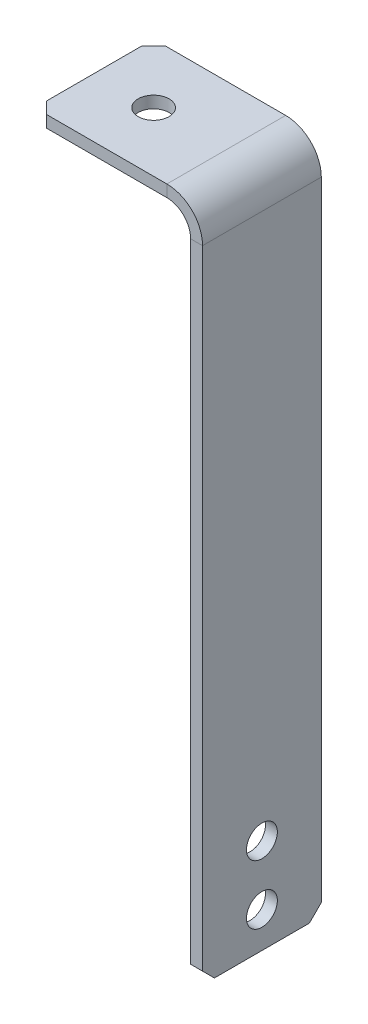
ISO-10303-21;
HEADER;
FILE_DESCRIPTION(('STEP AP214'),'2;1');
FILE_NAME('part.step','',(''),(''),'','','');
FILE_SCHEMA(('AUTOMOTIVE_DESIGN { 1 0 10303 214 1 1 1 1 }'));
ENDSEC;
DATA;
#1=APPLICATION_CONTEXT('core data for automotive mechanical design processes');
#2=APPLICATION_PROTOCOL_DEFINITION('international standard','automotive_design',2000,#1);
#3=PRODUCT_CONTEXT('',#1,'mechanical');
#4=PRODUCT('Part','Part','',(#3));
#5=PRODUCT_RELATED_PRODUCT_CATEGORY('part','',(#4));
#6=PRODUCT_DEFINITION_FORMATION('','',#4);
#7=PRODUCT_DEFINITION_CONTEXT('part definition',#1,'design');
#8=PRODUCT_DEFINITION('design','',#6,#7);
#9=PRODUCT_DEFINITION_SHAPE('','',#8);
#10=(LENGTH_UNIT() NAMED_UNIT(*) SI_UNIT(.MILLI.,.METRE.));
#11=(NAMED_UNIT(*) PLANE_ANGLE_UNIT() SI_UNIT($,.RADIAN.));
#12=(NAMED_UNIT(*) SI_UNIT($,.STERADIAN.) SOLID_ANGLE_UNIT());
#13=UNCERTAINTY_MEASURE_WITH_UNIT(LENGTH_MEASURE(1.E-05),#10,'distance_accuracy_value','');
#14=(GEOMETRIC_REPRESENTATION_CONTEXT(3) GLOBAL_UNCERTAINTY_ASSIGNED_CONTEXT((#13)) GLOBAL_UNIT_ASSIGNED_CONTEXT((#10,
#11,#12)) REPRESENTATION_CONTEXT('',''));
#15=CARTESIAN_POINT('',(0.,0.,0.));
#16=DIRECTION('',(0.,0.,1.));
#17=DIRECTION('',(1.,0.,0.));
#18=AXIS2_PLACEMENT_3D('',#15,#16,#17);
#19=CARTESIAN_POINT('',(0.,269.5,50.));
#20=DIRECTION('',(0.,0.,1.));
#21=DIRECTION('',(1.,0.,0.));
#22=AXIS2_PLACEMENT_3D('',#19,#20,#21);
#23=PLANE('',#22);
#24=DIRECTION('',(-1.,0.,0.));
#25=VECTOR('',#24,1.);
#26=CARTESIAN_POINT('',(0.,269.5,50.));
#27=LINE('',#26,#25);
#28=CARTESIAN_POINT('',(0.,269.5,50.));
#29=VERTEX_POINT('',#28);
#30=CARTESIAN_POINT('',(-4.99999999999999,269.5,50.));
#31=VERTEX_POINT('',#30);
#32=EDGE_CURVE('E134',#29,#31,#27,.T.);
#33=ORIENTED_EDGE('',*,*,#32,.F.);
#34=CARTESIAN_POINT('',(-15.,269.5,50.));
#35=DIRECTION('',(0.,0.,1.));
#36=DIRECTION('',(1.,0.,0.));
#37=AXIS2_PLACEMENT_3D('',#34,#35,#36);
#38=CIRCLE('',#37,15.);
#39=CARTESIAN_POINT('',(-15.,284.5,50.));
#40=VERTEX_POINT('',#39);
#41=EDGE_CURVE('E138',#40,#29,#38,.F.);
#42=ORIENTED_EDGE('',*,*,#41,.F.);
#43=DIRECTION('',(0.,1.,0.));
#44=VECTOR('',#43,1.);
#45=CARTESIAN_POINT('',(-15.,279.5,50.));
#46=LINE('',#45,#44);
#47=CARTESIAN_POINT('',(-15.,279.5,50.));
#48=VERTEX_POINT('',#47);
#49=EDGE_CURVE('E143',#48,#40,#46,.T.);
#50=ORIENTED_EDGE('',*,*,#49,.F.);
#51=CARTESIAN_POINT('',(-15.,269.5,50.));
#52=DIRECTION('',(0.,0.,1.));
#53=DIRECTION('',(1.,0.,0.));
#54=AXIS2_PLACEMENT_3D('',#51,#52,#53);
#55=CIRCLE('',#54,10.);
#56=EDGE_CURVE('E140',#48,#31,#55,.F.);
#57=ORIENTED_EDGE('',*,*,#56,.T.);
#58=EDGE_LOOP('',(#33,#42,#50,#57));
#59=FACE_BOUND('',#58,.T.);
#60=ADVANCED_FACE('F45',(#59),#23,.T.);
#61=CARTESIAN_POINT('',(-15.,279.5,50.));
#62=DIRECTION('',(0.,0.,1.));
#63=DIRECTION('',(1.,0.,0.));
#64=AXIS2_PLACEMENT_3D('',#61,#62,#63);
#65=PLANE('',#64);
#66=DIRECTION('',(0.,-1.,0.));
#67=VECTOR('',#66,1.);
#68=CARTESIAN_POINT('',(-4.99999999999998,284.5,50.));
#69=LINE('',#68,#67);
#70=CARTESIAN_POINT('',(-5.,5.00000000000006,50.));
#71=VERTEX_POINT('',#70);
#72=EDGE_CURVE('E161',#31,#71,#69,.T.);
#73=ORIENTED_EDGE('',*,*,#72,.T.);
#74=DIRECTION('',(1.,0.,0.));
#75=VECTOR('',#74,1.);
#76=CARTESIAN_POINT('',(-15.,5.00000000000006,50.));
#77=LINE('',#76,#75);
#78=CARTESIAN_POINT('',(0.,5.00000000000006,50.));
#79=VERTEX_POINT('',#78);
#80=EDGE_CURVE('E53',#71,#79,#77,.T.);
#81=ORIENTED_EDGE('',*,*,#80,.T.);
#82=DIRECTION('',(0.,-1.,0.));
#83=VECTOR('',#82,1.);
#84=CARTESIAN_POINT('',(0.,284.5,50.));
#85=LINE('',#84,#83);
#86=EDGE_CURVE('E150',#29,#79,#85,.T.);
#87=ORIENTED_EDGE('',*,*,#86,.F.);
#88=ORIENTED_EDGE('',*,*,#32,.T.);
#89=EDGE_LOOP('',(#73,#81,#87,#88));
#90=FACE_BOUND('',#89,.T.);
#91=ADVANCED_FACE('F160',(#90),#65,.T.);
#92=CARTESIAN_POINT('',(-15.,284.5,0.));
#93=DIRECTION('',(0.,0.,-1.));
#94=DIRECTION('',(-1.,0.,0.));
#95=AXIS2_PLACEMENT_3D('',#92,#93,#94);
#96=PLANE('',#95);
#97=DIRECTION('',(0.,-1.,0.));
#98=VECTOR('',#97,1.);
#99=CARTESIAN_POINT('',(-15.,284.5,0.));
#100=LINE('',#99,#98);
#101=CARTESIAN_POINT('',(-15.,284.5,0.));
#102=VERTEX_POINT('',#101);
#103=CARTESIAN_POINT('',(-15.,279.5,0.));
#104=VERTEX_POINT('',#103);
#105=EDGE_CURVE('E204',#102,#104,#100,.T.);
#106=ORIENTED_EDGE('',*,*,#105,.F.);
#107=CARTESIAN_POINT('',(-15.,269.5,0.));
#108=DIRECTION('',(0.,0.,1.));
#109=DIRECTION('',(1.,0.,0.));
#110=AXIS2_PLACEMENT_3D('',#107,#108,#109);
#111=CIRCLE('',#110,15.);
#112=CARTESIAN_POINT('',(0.,269.5,0.));
#113=VERTEX_POINT('',#112);
#114=EDGE_CURVE('E180',#102,#113,#111,.F.);
#115=ORIENTED_EDGE('',*,*,#114,.T.);
#116=DIRECTION('',(1.,0.,0.));
#117=VECTOR('',#116,1.);
#118=CARTESIAN_POINT('',(-4.99999999999999,269.5,0.));
#119=LINE('',#118,#117);
#120=CARTESIAN_POINT('',(-4.99999999999999,269.5,0.));
#121=VERTEX_POINT('',#120);
#122=EDGE_CURVE('E202',#121,#113,#119,.T.);
#123=ORIENTED_EDGE('',*,*,#122,.F.);
#124=CARTESIAN_POINT('',(-15.,269.5,0.));
#125=DIRECTION('',(0.,0.,1.));
#126=DIRECTION('',(1.,0.,0.));
#127=AXIS2_PLACEMENT_3D('',#124,#125,#126);
#128=CIRCLE('',#127,10.);
#129=EDGE_CURVE('E186',#104,#121,#128,.F.);
#130=ORIENTED_EDGE('',*,*,#129,.F.);
#131=EDGE_LOOP('',(#106,#115,#123,#130));
#132=FACE_BOUND('',#131,.T.);
#133=ADVANCED_FACE('F269',(#132),#96,.T.);
#134=CARTESIAN_POINT('',(-4.99999999999999,269.5,0.));
#135=DIRECTION('',(0.,0.,-1.));
#136=DIRECTION('',(-1.,0.,0.));
#137=AXIS2_PLACEMENT_3D('',#134,#135,#136);
#138=PLANE('',#137);
#139=DIRECTION('',(1.,0.,0.));
#140=VECTOR('',#139,1.);
#141=CARTESIAN_POINT('',(-70.6,279.5,0.));
#142=LINE('',#141,#140);
#143=CARTESIAN_POINT('',(-65.6,279.5,0.));
#144=VERTEX_POINT('',#143);
#145=EDGE_CURVE('E184',#144,#104,#142,.T.);
#146=ORIENTED_EDGE('',*,*,#145,.F.);
#147=DIRECTION('',(0.,1.,0.));
#148=VECTOR('',#147,1.);
#149=CARTESIAN_POINT('',(-65.6,269.5,0.));
#150=LINE('',#149,#148);
#151=CARTESIAN_POINT('',(-65.6,284.5,0.));
#152=VERTEX_POINT('',#151);
#153=EDGE_CURVE('E142',#144,#152,#150,.T.);
#154=ORIENTED_EDGE('',*,*,#153,.T.);
#155=DIRECTION('',(1.,0.,0.));
#156=VECTOR('',#155,1.);
#157=CARTESIAN_POINT('',(-70.6,284.5,0.));
#158=LINE('',#157,#156);
#159=EDGE_CURVE('E182',#152,#102,#158,.T.);
#160=ORIENTED_EDGE('',*,*,#159,.T.);
#161=ORIENTED_EDGE('',*,*,#105,.T.);
#162=EDGE_LOOP('',(#146,#154,#160,#161));
#163=FACE_BOUND('',#162,.T.);
#164=ADVANCED_FACE('F286',(#163),#138,.T.);
#165=CARTESIAN_POINT('',(-4.99999999999998,284.5,50.));
#166=DIRECTION('',(1.,0.,0.));
#167=DIRECTION('',(0.,1.,0.));
#168=AXIS2_PLACEMENT_3D('',#165,#166,#167);
#169=PLANE('',#168);
#170=CARTESIAN_POINT('',(-5.00000000000001,40.,25.));
#171=DIRECTION('',(-1.,0.,0.));
#172=DIRECTION('',(0.,-1.,0.));
#173=AXIS2_PLACEMENT_3D('',#170,#171,#172);
#174=CIRCLE('',#173,6.5);
#175=CARTESIAN_POINT('',(-5.00000000000001,33.5,25.));
#176=VERTEX_POINT('',#175);
#177=EDGE_CURVE('E216',#176,#176,#174,.T.);
#178=ORIENTED_EDGE('',*,*,#177,.F.);
#179=EDGE_LOOP('',(#178));
#180=FACE_BOUND('',#179,.T.);
#181=CARTESIAN_POINT('',(-5.,15.,25.));
#182=DIRECTION('',(-1.,0.,0.));
#183=DIRECTION('',(0.,-1.,0.));
#184=AXIS2_PLACEMENT_3D('',#181,#182,#183);
#185=CIRCLE('',#184,6.5);
#186=CARTESIAN_POINT('',(-5.,8.50000000000001,25.));
#187=VERTEX_POINT('',#186);
#188=EDGE_CURVE('E276',#187,#187,#185,.T.);
#189=ORIENTED_EDGE('',*,*,#188,.F.);
#190=EDGE_LOOP('',(#189));
#191=FACE_BOUND('',#190,.T.);
#192=DIRECTION('',(0.,0.,-1.));
#193=VECTOR('',#192,1.);
#194=CARTESIAN_POINT('',(-5.,0.,50.));
#195=LINE('',#194,#193);
#196=CARTESIAN_POINT('',(-5.,0.,45.));
#197=VERTEX_POINT('',#196);
#198=CARTESIAN_POINT('',(-5.,0.,5.00000000000003));
#199=VERTEX_POINT('',#198);
#200=EDGE_CURVE('E200',#197,#199,#195,.T.);
#201=ORIENTED_EDGE('',*,*,#200,.F.);
#202=DIRECTION('',(0.,-0.707106781186549,-0.707106781186546));
#203=VECTOR('',#202,1.);
#204=CARTESIAN_POINT('',(-5.,0.,45.));
#205=LINE('',#204,#203);
#206=EDGE_CURVE('E67',#197,#71,#205,.F.);
#207=ORIENTED_EDGE('',*,*,#206,.T.);
#208=ORIENTED_EDGE('',*,*,#72,.F.);
#209=DIRECTION('',(0.,0.,-1.));
#210=VECTOR('',#209,1.);
#211=CARTESIAN_POINT('',(-4.99999999999999,269.5,50.));
#212=LINE('',#211,#210);
#213=EDGE_CURVE('E174',#31,#121,#212,.T.);
#214=ORIENTED_EDGE('',*,*,#213,.T.);
#215=DIRECTION('',(0.,-1.,0.));
#216=VECTOR('',#215,1.);
#217=CARTESIAN_POINT('',(-4.99999999999998,284.5,0.));
#218=LINE('',#217,#216);
#219=CARTESIAN_POINT('',(-5.,5.00000000000006,0.));
#220=VERTEX_POINT('',#219);
#221=EDGE_CURVE('E175',#121,#220,#218,.T.);
#222=ORIENTED_EDGE('',*,*,#221,.T.);
#223=DIRECTION('',(0.,-0.707106781186549,0.707106781186546));
#224=VECTOR('',#223,1.);
#225=CARTESIAN_POINT('',(-5.,5.00000000000006,0.));
#226=LINE('',#225,#224);
#227=EDGE_CURVE('E241',#220,#199,#226,.T.);
#228=ORIENTED_EDGE('',*,*,#227,.T.);
#229=EDGE_LOOP('',(#201,#207,#208,#214,#222,#228));
#230=FACE_BOUND('',#229,.T.);
#231=ADVANCED_FACE('F257',(#180,#191,#230),#169,.F.);
#232=CARTESIAN_POINT('',(0.,0.,50.));
#233=DIRECTION('',(0.,-1.,0.));
#234=DIRECTION('',(0.,0.,-1.));
#235=AXIS2_PLACEMENT_3D('',#232,#233,#234);
#236=PLANE('',#235);
#237=DIRECTION('',(0.,0.,-1.));
#238=VECTOR('',#237,1.);
#239=CARTESIAN_POINT('',(0.,0.,50.));
#240=LINE('',#239,#238);
#241=CARTESIAN_POINT('',(0.,0.,45.));
#242=VERTEX_POINT('',#241);
#243=CARTESIAN_POINT('',(0.,0.,5.00000000000003));
#244=VERTEX_POINT('',#243);
#245=EDGE_CURVE('E157',#242,#244,#240,.T.);
#246=ORIENTED_EDGE('',*,*,#245,.F.);
#247=DIRECTION('',(-1.,0.,0.));
#248=VECTOR('',#247,1.);
#249=CARTESIAN_POINT('',(0.,0.,45.));
#250=LINE('',#249,#248);
#251=EDGE_CURVE('E249',#242,#197,#250,.T.);
#252=ORIENTED_EDGE('',*,*,#251,.T.);
#253=ORIENTED_EDGE('',*,*,#200,.T.);
#254=DIRECTION('',(1.,0.,0.));
#255=VECTOR('',#254,1.);
#256=CARTESIAN_POINT('',(0.,0.,5.00000000000003));
#257=LINE('',#256,#255);
#258=EDGE_CURVE('E244',#199,#244,#257,.T.);
#259=ORIENTED_EDGE('',*,*,#258,.T.);
#260=EDGE_LOOP('',(#246,#252,#253,#259));
#261=FACE_BOUND('',#260,.T.);
#262=ADVANCED_FACE('F255',(#261),#236,.T.);
#263=CARTESIAN_POINT('',(0.,284.5,50.));
#264=DIRECTION('',(1.,0.,0.));
#265=DIRECTION('',(0.,1.,0.));
#266=AXIS2_PLACEMENT_3D('',#263,#264,#265);
#267=PLANE('',#266);
#268=CARTESIAN_POINT('',(0.,40.,25.));
#269=DIRECTION('',(1.,0.,0.));
#270=DIRECTION('',(0.,1.,0.));
#271=AXIS2_PLACEMENT_3D('',#268,#269,#270);
#272=CIRCLE('',#271,6.5);
#273=CARTESIAN_POINT('',(0.,46.5,25.));
#274=VERTEX_POINT('',#273);
#275=EDGE_CURVE('E215',#274,#274,#272,.T.);
#276=ORIENTED_EDGE('',*,*,#275,.F.);
#277=EDGE_LOOP('',(#276));
#278=FACE_BOUND('',#277,.T.);
#279=CARTESIAN_POINT('',(0.,15.,25.));
#280=DIRECTION('',(1.,0.,0.));
#281=DIRECTION('',(0.,1.,0.));
#282=AXIS2_PLACEMENT_3D('',#279,#280,#281);
#283=CIRCLE('',#282,6.5);
#284=CARTESIAN_POINT('',(0.,21.5,25.));
#285=VERTEX_POINT('',#284);
#286=EDGE_CURVE('E212',#285,#285,#283,.T.);
#287=ORIENTED_EDGE('',*,*,#286,.F.);
#288=EDGE_LOOP('',(#287));
#289=FACE_BOUND('',#288,.T.);
#290=ORIENTED_EDGE('',*,*,#86,.T.);
#291=DIRECTION('',(0.,0.707106781186549,0.707106781186546));
#292=VECTOR('',#291,1.);
#293=CARTESIAN_POINT('',(0.,144.750000000001,189.75));
#294=LINE('',#293,#292);
#295=EDGE_CURVE('E11',#79,#242,#294,.F.);
#296=ORIENTED_EDGE('',*,*,#295,.T.);
#297=ORIENTED_EDGE('',*,*,#245,.T.);
#298=DIRECTION('',(0.,0.707106781186549,-0.707106781186546));
#299=VECTOR('',#298,1.);
#300=CARTESIAN_POINT('',(0.,119.750000000001,-114.75));
#301=LINE('',#300,#299);
#302=CARTESIAN_POINT('',(0.,5.00000000000006,0.));
#303=VERTEX_POINT('',#302);
#304=EDGE_CURVE('E247',#244,#303,#301,.T.);
#305=ORIENTED_EDGE('',*,*,#304,.T.);
#306=DIRECTION('',(0.,-1.,0.));
#307=VECTOR('',#306,1.);
#308=CARTESIAN_POINT('',(0.,284.5,0.));
#309=LINE('',#308,#307);
#310=EDGE_CURVE('E153',#113,#303,#309,.T.);
#311=ORIENTED_EDGE('',*,*,#310,.F.);
#312=DIRECTION('',(0.,0.,-1.));
#313=VECTOR('',#312,1.);
#314=CARTESIAN_POINT('',(0.,269.5,50.));
#315=LINE('',#314,#313);
#316=EDGE_CURVE('E148',#29,#113,#315,.T.);
#317=ORIENTED_EDGE('',*,*,#316,.F.);
#318=EDGE_LOOP('',(#290,#296,#297,#305,#311,#317));
#319=FACE_BOUND('',#318,.T.);
#320=ADVANCED_FACE('F149',(#278,#289,#319),#267,.T.);
#321=CARTESIAN_POINT('',(-15.,269.5,50.));
#322=DIRECTION('',(0.,0.,-1.));
#323=DIRECTION('',(-1.,0.,0.));
#324=AXIS2_PLACEMENT_3D('',#321,#322,#323);
#325=CYLINDRICAL_SURFACE('',#324,15.);
#326=ORIENTED_EDGE('',*,*,#114,.F.);
#327=DIRECTION('',(0.,0.,-1.));
#328=VECTOR('',#327,1.);
#329=CARTESIAN_POINT('',(-15.,284.5,50.));
#330=LINE('',#329,#328);
#331=EDGE_CURVE('E158',#40,#102,#330,.T.);
#332=ORIENTED_EDGE('',*,*,#331,.F.);
#333=ORIENTED_EDGE('',*,*,#41,.T.);
#334=ORIENTED_EDGE('',*,*,#316,.T.);
#335=EDGE_LOOP('',(#326,#332,#333,#334));
#336=FACE_BOUND('',#335,.T.);
#337=ADVANCED_FACE('F164',(#336),#325,.T.);
#338=CARTESIAN_POINT('',(-70.6,284.5,50.));
#339=DIRECTION('',(0.,1.,0.));
#340=DIRECTION('',(0.,0.,1.));
#341=AXIS2_PLACEMENT_3D('',#338,#339,#340);
#342=PLANE('',#341);
#343=CARTESIAN_POINT('',(-45.6000000000001,284.5,25.));
#344=DIRECTION('',(0.,1.,0.));
#345=DIRECTION('',(-1.,0.,0.));
#346=AXIS2_PLACEMENT_3D('',#343,#344,#345);
#347=CIRCLE('',#346,6.5);
#348=CARTESIAN_POINT('',(-52.1000000000001,284.5,25.));
#349=VERTEX_POINT('',#348);
#350=EDGE_CURVE('E211',#349,#349,#347,.T.);
#351=ORIENTED_EDGE('',*,*,#350,.F.);
#352=EDGE_LOOP('',(#351));
#353=FACE_BOUND('',#352,.T.);
#354=DIRECTION('',(0.,0.,-1.));
#355=VECTOR('',#354,1.);
#356=CARTESIAN_POINT('',(-70.6,284.5,50.));
#357=LINE('',#356,#355);
#358=CARTESIAN_POINT('',(-70.6,284.5,45.));
#359=VERTEX_POINT('',#358);
#360=CARTESIAN_POINT('',(-70.6,284.5,5.00000000000003));
#361=VERTEX_POINT('',#360);
#362=EDGE_CURVE('E196',#359,#361,#357,.T.);
#363=ORIENTED_EDGE('',*,*,#362,.F.);
#364=DIRECTION('',(-0.707106781186548,0.,-0.707106781186548));
#365=VECTOR('',#364,1.);
#366=CARTESIAN_POINT('',(-68.1,284.5,47.5));
#367=LINE('',#366,#365);
#368=CARTESIAN_POINT('',(-65.6,284.5,50.));
#369=VERTEX_POINT('',#368);
#370=EDGE_CURVE('E232',#359,#369,#367,.F.);
#371=ORIENTED_EDGE('',*,*,#370,.T.);
#372=DIRECTION('',(1.,0.,0.));
#373=VECTOR('',#372,1.);
#374=CARTESIAN_POINT('',(-70.6,284.5,50.));
#375=LINE('',#374,#373);
#376=EDGE_CURVE('E166',#369,#40,#375,.T.);
#377=ORIENTED_EDGE('',*,*,#376,.T.);
#378=ORIENTED_EDGE('',*,*,#331,.T.);
#379=ORIENTED_EDGE('',*,*,#159,.F.);
#380=DIRECTION('',(0.707106781186548,0.,-0.707106781186548));
#381=VECTOR('',#380,1.);
#382=CARTESIAN_POINT('',(-93.1,284.5,27.5));
#383=LINE('',#382,#381);
#384=EDGE_CURVE('E221',#152,#361,#383,.F.);
#385=ORIENTED_EDGE('',*,*,#384,.T.);
#386=EDGE_LOOP('',(#363,#371,#377,#378,#379,#385));
#387=FACE_BOUND('',#386,.T.);
#388=ADVANCED_FACE('F418',(#353,#387),#342,.T.);
#389=CARTESIAN_POINT('',(-70.6,279.5,50.));
#390=DIRECTION('',(-1.,0.,0.));
#391=DIRECTION('',(0.,0.,1.));
#392=AXIS2_PLACEMENT_3D('',#389,#390,#391);
#393=PLANE('',#392);
#394=DIRECTION('',(0.,0.,-1.));
#395=VECTOR('',#394,1.);
#396=CARTESIAN_POINT('',(-70.6,279.5,50.));
#397=LINE('',#396,#395);
#398=CARTESIAN_POINT('',(-70.6,279.5,45.));
#399=VERTEX_POINT('',#398);
#400=CARTESIAN_POINT('',(-70.6,279.5,5.00000000000003));
#401=VERTEX_POINT('',#400);
#402=EDGE_CURVE('E194',#399,#401,#397,.T.);
#403=ORIENTED_EDGE('',*,*,#402,.F.);
#404=DIRECTION('',(0.,1.,0.));
#405=VECTOR('',#404,1.);
#406=CARTESIAN_POINT('',(-70.6,279.5,45.));
#407=LINE('',#406,#405);
#408=EDGE_CURVE('E229',#399,#359,#407,.T.);
#409=ORIENTED_EDGE('',*,*,#408,.T.);
#410=ORIENTED_EDGE('',*,*,#362,.T.);
#411=DIRECTION('',(0.,-1.,0.));
#412=VECTOR('',#411,1.);
#413=CARTESIAN_POINT('',(-70.6,279.5,5.00000000000003));
#414=LINE('',#413,#412);
#415=EDGE_CURVE('E224',#361,#401,#414,.T.);
#416=ORIENTED_EDGE('',*,*,#415,.T.);
#417=EDGE_LOOP('',(#403,#409,#410,#416));
#418=FACE_BOUND('',#417,.T.);
#419=ADVANCED_FACE('F407',(#418),#393,.T.);
#420=CARTESIAN_POINT('',(-70.6,279.5,50.));
#421=DIRECTION('',(0.,1.,0.));
#422=DIRECTION('',(0.,0.,1.));
#423=AXIS2_PLACEMENT_3D('',#420,#421,#422);
#424=PLANE('',#423);
#425=CARTESIAN_POINT('',(-45.6000000000001,279.5,25.));
#426=DIRECTION('',(0.,1.,0.));
#427=DIRECTION('',(0.,0.,1.));
#428=AXIS2_PLACEMENT_3D('',#425,#426,#427);
#429=CIRCLE('',#428,6.5);
#430=CARTESIAN_POINT('',(-45.6000000000001,279.5,31.5));
#431=VERTEX_POINT('',#430);
#432=EDGE_CURVE('E178',#431,#431,#429,.T.);
#433=ORIENTED_EDGE('',*,*,#432,.T.);
#434=EDGE_LOOP('',(#433));
#435=FACE_BOUND('',#434,.T.);
#436=DIRECTION('',(1.,0.,0.));
#437=VECTOR('',#436,1.);
#438=CARTESIAN_POINT('',(-70.6,279.5,50.));
#439=LINE('',#438,#437);
#440=CARTESIAN_POINT('',(-65.6,279.5,50.));
#441=VERTEX_POINT('',#440);
#442=EDGE_CURVE('E168',#441,#48,#439,.T.);
#443=ORIENTED_EDGE('',*,*,#442,.F.);
#444=DIRECTION('',(0.707106781186548,0.,0.707106781186548));
#445=VECTOR('',#444,1.);
#446=CARTESIAN_POINT('',(-70.6,279.5,45.));
#447=LINE('',#446,#445);
#448=EDGE_CURVE('E236',#441,#399,#447,.F.);
#449=ORIENTED_EDGE('',*,*,#448,.T.);
#450=ORIENTED_EDGE('',*,*,#402,.T.);
#451=DIRECTION('',(-0.707106781186548,0.,0.707106781186548));
#452=VECTOR('',#451,1.);
#453=CARTESIAN_POINT('',(-65.6,279.5,0.));
#454=LINE('',#453,#452);
#455=EDGE_CURVE('E227',#401,#144,#454,.F.);
#456=ORIENTED_EDGE('',*,*,#455,.T.);
#457=ORIENTED_EDGE('',*,*,#145,.T.);
#458=DIRECTION('',(0.,0.,-1.));
#459=VECTOR('',#458,1.);
#460=CARTESIAN_POINT('',(-15.,279.5,50.));
#461=LINE('',#460,#459);
#462=EDGE_CURVE('E191',#48,#104,#461,.T.);
#463=ORIENTED_EDGE('',*,*,#462,.F.);
#464=EDGE_LOOP('',(#443,#449,#450,#456,#457,#463));
#465=FACE_BOUND('',#464,.T.);
#466=ADVANCED_FACE('F397',(#435,#465),#424,.F.);
#467=CARTESIAN_POINT('',(-15.,269.5,50.));
#468=DIRECTION('',(0.,0.,-1.));
#469=DIRECTION('',(-1.,0.,0.));
#470=AXIS2_PLACEMENT_3D('',#467,#468,#469);
#471=CYLINDRICAL_SURFACE('',#470,10.);
#472=ORIENTED_EDGE('',*,*,#129,.T.);
#473=ORIENTED_EDGE('',*,*,#213,.F.);
#474=ORIENTED_EDGE('',*,*,#56,.F.);
#475=ORIENTED_EDGE('',*,*,#462,.T.);
#476=EDGE_LOOP('',(#472,#473,#474,#475));
#477=FACE_BOUND('',#476,.T.);
#478=ADVANCED_FACE('F271',(#477),#471,.F.);
#479=CARTESIAN_POINT('',(-15.,269.5,50.));
#480=DIRECTION('',(0.,0.,1.));
#481=DIRECTION('',(1.,0.,0.));
#482=AXIS2_PLACEMENT_3D('',#479,#480,#481);
#483=PLANE('',#482);
#484=ORIENTED_EDGE('',*,*,#376,.F.);
#485=DIRECTION('',(0.,-1.,0.));
#486=VECTOR('',#485,1.);
#487=CARTESIAN_POINT('',(-65.6,269.5,50.));
#488=LINE('',#487,#486);
#489=EDGE_CURVE('E234',#369,#441,#488,.T.);
#490=ORIENTED_EDGE('',*,*,#489,.T.);
#491=ORIENTED_EDGE('',*,*,#442,.T.);
#492=ORIENTED_EDGE('',*,*,#49,.T.);
#493=EDGE_LOOP('',(#484,#490,#491,#492));
#494=FACE_BOUND('',#493,.T.);
#495=ADVANCED_FACE('F377',(#494),#483,.T.);
#496=CARTESIAN_POINT('',(-15.,269.5,0.));
#497=DIRECTION('',(0.,0.,1.));
#498=DIRECTION('',(1.,0.,0.));
#499=AXIS2_PLACEMENT_3D('',#496,#497,#498);
#500=PLANE('',#499);
#501=ORIENTED_EDGE('',*,*,#310,.T.);
#502=DIRECTION('',(-1.,0.,0.));
#503=VECTOR('',#502,1.);
#504=CARTESIAN_POINT('',(-5.,5.00000000000006,0.));
#505=LINE('',#504,#503);
#506=EDGE_CURVE('E238',#303,#220,#505,.T.);
#507=ORIENTED_EDGE('',*,*,#506,.T.);
#508=ORIENTED_EDGE('',*,*,#221,.F.);
#509=ORIENTED_EDGE('',*,*,#122,.T.);
#510=EDGE_LOOP('',(#501,#507,#508,#509));
#511=FACE_BOUND('',#510,.T.);
#512=ADVANCED_FACE('F265',(#511),#500,.F.);
#513=CARTESIAN_POINT('',(-45.6000000000001,274.5,25.));
#514=DIRECTION('',(0.,1.,0.));
#515=DIRECTION('',(-1.,0.,0.));
#516=AXIS2_PLACEMENT_3D('',#513,#514,#515);
#517=CYLINDRICAL_SURFACE('',#516,6.5);
#518=ORIENTED_EDGE('',*,*,#350,.T.);
#519=EDGE_LOOP('',(#518));
#520=FACE_BOUND('',#519,.T.);
#521=ORIENTED_EDGE('',*,*,#432,.F.);
#522=EDGE_LOOP('',(#521));
#523=FACE_BOUND('',#522,.T.);
#524=ADVANCED_FACE('F292',(#520,#523),#517,.F.);
#525=CARTESIAN_POINT('',(5.,15.,25.));
#526=DIRECTION('',(-1.,0.,0.));
#527=DIRECTION('',(0.,-1.,0.));
#528=AXIS2_PLACEMENT_3D('',#525,#526,#527);
#529=CYLINDRICAL_SURFACE('',#528,6.5);
#530=ORIENTED_EDGE('',*,*,#286,.T.);
#531=EDGE_LOOP('',(#530));
#532=FACE_BOUND('',#531,.T.);
#533=ORIENTED_EDGE('',*,*,#188,.T.);
#534=EDGE_LOOP('',(#533));
#535=FACE_BOUND('',#534,.T.);
#536=ADVANCED_FACE('F290',(#532,#535),#529,.F.);
#537=CARTESIAN_POINT('',(4.99999999999999,40.,25.));
#538=DIRECTION('',(-1.,0.,0.));
#539=DIRECTION('',(0.,-1.,0.));
#540=AXIS2_PLACEMENT_3D('',#537,#538,#539);
#541=CYLINDRICAL_SURFACE('',#540,6.5);
#542=ORIENTED_EDGE('',*,*,#275,.T.);
#543=EDGE_LOOP('',(#542));
#544=FACE_BOUND('',#543,.T.);
#545=ORIENTED_EDGE('',*,*,#177,.T.);
#546=EDGE_LOOP('',(#545));
#547=FACE_BOUND('',#546,.T.);
#548=ADVANCED_FACE('F282',(#544,#547),#541,.F.);
#549=CARTESIAN_POINT('',(-65.6,269.5,0.));
#550=DIRECTION('',(0.707106781186547,0.,0.707106781186547));
#551=DIRECTION('',(0.,1.,0.));
#552=AXIS2_PLACEMENT_3D('',#549,#550,#551);
#553=PLANE('',#552);
#554=ORIENTED_EDGE('',*,*,#455,.F.);
#555=ORIENTED_EDGE('',*,*,#415,.F.);
#556=ORIENTED_EDGE('',*,*,#384,.F.);
#557=ORIENTED_EDGE('',*,*,#153,.F.);
#558=EDGE_LOOP('',(#554,#555,#556,#557));
#559=FACE_BOUND('',#558,.T.);
#560=ADVANCED_FACE('F299',(#559),#553,.F.);
#561=CARTESIAN_POINT('',(-70.6,279.5,45.));
#562=DIRECTION('',(0.707106781186547,0.,-0.707106781186547));
#563=DIRECTION('',(0.,1.,0.));
#564=AXIS2_PLACEMENT_3D('',#561,#562,#563);
#565=PLANE('',#564);
#566=ORIENTED_EDGE('',*,*,#448,.F.);
#567=ORIENTED_EDGE('',*,*,#489,.F.);
#568=ORIENTED_EDGE('',*,*,#370,.F.);
#569=ORIENTED_EDGE('',*,*,#408,.F.);
#570=EDGE_LOOP('',(#566,#567,#568,#569));
#571=FACE_BOUND('',#570,.T.);
#572=ADVANCED_FACE('F315',(#571),#565,.F.);
#573=CARTESIAN_POINT('',(-15.,5.00000000000006,0.));
#574=DIRECTION('',(0.,-0.707106781186546,-0.707106781186549));
#575=DIRECTION('',(1.,0.,0.));
#576=AXIS2_PLACEMENT_3D('',#573,#574,#575);
#577=PLANE('',#576);
#578=ORIENTED_EDGE('',*,*,#304,.F.);
#579=ORIENTED_EDGE('',*,*,#258,.F.);
#580=ORIENTED_EDGE('',*,*,#227,.F.);
#581=ORIENTED_EDGE('',*,*,#506,.F.);
#582=EDGE_LOOP('',(#578,#579,#580,#581));
#583=FACE_BOUND('',#582,.T.);
#584=ADVANCED_FACE('F263',(#583),#577,.T.);
#585=CARTESIAN_POINT('',(0.,0.,45.));
#586=DIRECTION('',(0.,0.707106781186546,-0.707106781186549));
#587=DIRECTION('',(-1.,0.,0.));
#588=AXIS2_PLACEMENT_3D('',#585,#586,#587);
#589=PLANE('',#588);
#590=ORIENTED_EDGE('',*,*,#295,.F.);
#591=ORIENTED_EDGE('',*,*,#80,.F.);
#592=ORIENTED_EDGE('',*,*,#206,.F.);
#593=ORIENTED_EDGE('',*,*,#251,.F.);
#594=EDGE_LOOP('',(#590,#591,#592,#593));
#595=FACE_BOUND('',#594,.T.);
#596=ADVANCED_FACE('F47',(#595),#589,.F.);
#597=CLOSED_SHELL('',(#60,#91,#133,#164,#231,#262,#320,#337,#388,#419,#466,#478,#495,#512,#524,
#536,#548,#560,#572,#584,#596));
#598=MANIFOLD_SOLID_BREP('B2',#597);
#599=ADVANCED_BREP_SHAPE_REPRESENTATION('',(#18,#598),#14);
#600=SHAPE_DEFINITION_REPRESENTATION(#9,#599);
ENDSEC;
END-ISO-10303-21;
